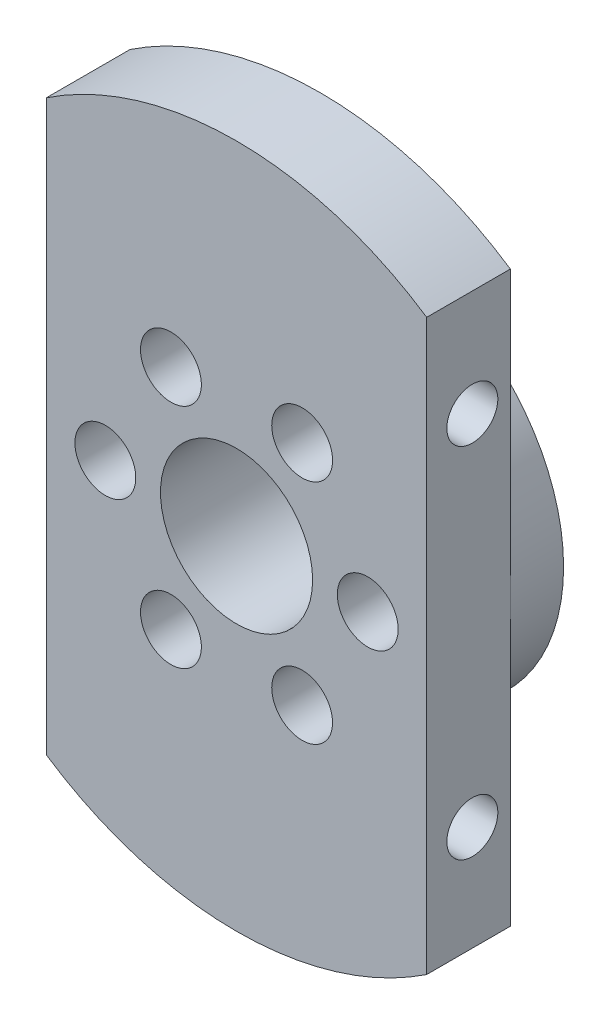
ISO-10303-21;
HEADER;
FILE_DESCRIPTION(('STEP AP214'),'2;1');
FILE_NAME('part.step','',(''),(''),'','','');
FILE_SCHEMA(('AUTOMOTIVE_DESIGN { 1 0 10303 214 1 1 1 1 }'));
ENDSEC;
DATA;
#1=APPLICATION_CONTEXT('core data for automotive mechanical design processes');
#2=APPLICATION_PROTOCOL_DEFINITION('international standard','automotive_design',2000,#1);
#3=PRODUCT_CONTEXT('',#1,'mechanical');
#4=PRODUCT('Part','Part','',(#3));
#5=PRODUCT_RELATED_PRODUCT_CATEGORY('part','',(#4));
#6=PRODUCT_DEFINITION_FORMATION('','',#4);
#7=PRODUCT_DEFINITION_CONTEXT('part definition',#1,'design');
#8=PRODUCT_DEFINITION('design','',#6,#7);
#9=PRODUCT_DEFINITION_SHAPE('','',#8);
#10=(LENGTH_UNIT() NAMED_UNIT(*) SI_UNIT(.MILLI.,.METRE.));
#11=(NAMED_UNIT(*) PLANE_ANGLE_UNIT() SI_UNIT($,.RADIAN.));
#12=(NAMED_UNIT(*) SI_UNIT($,.STERADIAN.) SOLID_ANGLE_UNIT());
#13=UNCERTAINTY_MEASURE_WITH_UNIT(LENGTH_MEASURE(1.E-05),#10,'distance_accuracy_value','');
#14=(GEOMETRIC_REPRESENTATION_CONTEXT(3) GLOBAL_UNCERTAINTY_ASSIGNED_CONTEXT((#13)) GLOBAL_UNIT_ASSIGNED_CONTEXT((#10,
#11,#12)) REPRESENTATION_CONTEXT('',''));
#15=CARTESIAN_POINT('',(0.,0.,0.));
#16=DIRECTION('',(0.,0.,1.));
#17=DIRECTION('',(1.,0.,0.));
#18=AXIS2_PLACEMENT_3D('',#15,#16,#17);
#19=CARTESIAN_POINT('',(25.,0.,0.));
#20=DIRECTION('',(1.,0.,0.));
#21=DIRECTION('',(0.,0.,1.));
#22=AXIS2_PLACEMENT_3D('',#19,#20,#21);
#23=PLANE('',#22);
#24=CARTESIAN_POINT('',(25.,23.45,-6.00000000000001));
#25=DIRECTION('',(-1.,0.,0.));
#26=DIRECTION('',(0.,0.,1.));
#27=AXIS2_PLACEMENT_3D('',#24,#25,#26);
#28=CIRCLE('',#27,3.35);
#29=CARTESIAN_POINT('',(25.,23.45,-2.65000000000001));
#30=VERTEX_POINT('',#29);
#31=EDGE_CURVE('E202',#30,#30,#28,.T.);
#32=ORIENTED_EDGE('',*,*,#31,.T.);
#33=EDGE_LOOP('',(#32));
#34=FACE_BOUND('',#33,.T.);
#35=CARTESIAN_POINT('',(25.,-23.63,-6.));
#36=DIRECTION('',(-1.,0.,0.));
#37=DIRECTION('',(0.,0.,1.));
#38=AXIS2_PLACEMENT_3D('',#35,#36,#37);
#39=CIRCLE('',#38,3.35);
#40=CARTESIAN_POINT('',(25.,-23.63,-2.65));
#41=VERTEX_POINT('',#40);
#42=EDGE_CURVE('E206',#41,#41,#39,.T.);
#43=ORIENTED_EDGE('',*,*,#42,.T.);
#44=EDGE_LOOP('',(#43));
#45=FACE_BOUND('',#44,.T.);
#46=DIRECTION('',(0.,1.,0.));
#47=VECTOR('',#46,1.);
#48=CARTESIAN_POINT('',(25.,0.,-11.));
#49=LINE('',#48,#47);
#50=CARTESIAN_POINT('',(25.,0.,-11.));
#51=VERTEX_POINT('',#50);
#52=CARTESIAN_POINT('',(25.,37.4165738677394,-11.));
#53=VERTEX_POINT('',#52);
#54=EDGE_CURVE('E107',#51,#53,#49,.T.);
#55=ORIENTED_EDGE('',*,*,#54,.T.);
#56=DIRECTION('',(0.,0.,-1.));
#57=VECTOR('',#56,1.);
#58=CARTESIAN_POINT('',(25.,37.4165738677394,0.));
#59=LINE('',#58,#57);
#60=CARTESIAN_POINT('',(25.,37.4165738677394,0.));
#61=VERTEX_POINT('',#60);
#62=EDGE_CURVE('E218',#61,#53,#59,.T.);
#63=ORIENTED_EDGE('',*,*,#62,.F.);
#64=DIRECTION('',(0.,1.,0.));
#65=VECTOR('',#64,1.);
#66=CARTESIAN_POINT('',(25.,0.,0.));
#67=LINE('',#66,#65);
#68=CARTESIAN_POINT('',(25.,-37.4165738677394,0.));
#69=VERTEX_POINT('',#68);
#70=EDGE_CURVE('E201',#69,#61,#67,.T.);
#71=ORIENTED_EDGE('',*,*,#70,.F.);
#72=DIRECTION('',(0.,0.,-1.));
#73=VECTOR('',#72,1.);
#74=CARTESIAN_POINT('',(25.,-37.4165738677394,0.));
#75=LINE('',#74,#73);
#76=CARTESIAN_POINT('',(25.,-37.4165738677394,-11.));
#77=VERTEX_POINT('',#76);
#78=EDGE_CURVE('E226',#69,#77,#75,.T.);
#79=ORIENTED_EDGE('',*,*,#78,.T.);
#80=DIRECTION('',(0.,1.,0.));
#81=VECTOR('',#80,1.);
#82=CARTESIAN_POINT('',(25.,0.,-11.));
#83=LINE('',#82,#81);
#84=EDGE_CURVE('E111',#77,#51,#83,.T.);
#85=ORIENTED_EDGE('',*,*,#84,.T.);
#86=EDGE_LOOP('',(#55,#63,#71,#79,#85));
#87=FACE_BOUND('',#86,.T.);
#88=ADVANCED_FACE('F51',(#34,#45,#87),#23,.T.);
#89=CARTESIAN_POINT('',(-25.,0.,0.));
#90=DIRECTION('',(1.,0.,0.));
#91=DIRECTION('',(0.,0.,1.));
#92=AXIS2_PLACEMENT_3D('',#89,#90,#91);
#93=PLANE('',#92);
#94=CARTESIAN_POINT('',(-25.,23.45,-6.00000000000001));
#95=DIRECTION('',(-1.,0.,0.));
#96=DIRECTION('',(0.,0.,1.));
#97=AXIS2_PLACEMENT_3D('',#94,#95,#96);
#98=CIRCLE('',#97,3.35);
#99=CARTESIAN_POINT('',(-25.,23.45,-2.65000000000001));
#100=VERTEX_POINT('',#99);
#101=EDGE_CURVE('E197',#100,#100,#98,.T.);
#102=ORIENTED_EDGE('',*,*,#101,.F.);
#103=EDGE_LOOP('',(#102));
#104=FACE_BOUND('',#103,.T.);
#105=CARTESIAN_POINT('',(-25.,-23.63,-6.));
#106=DIRECTION('',(-1.,0.,0.));
#107=DIRECTION('',(0.,0.,1.));
#108=AXIS2_PLACEMENT_3D('',#105,#106,#107);
#109=CIRCLE('',#108,3.35);
#110=CARTESIAN_POINT('',(-25.,-23.63,-2.65));
#111=VERTEX_POINT('',#110);
#112=EDGE_CURVE('E210',#111,#111,#109,.T.);
#113=ORIENTED_EDGE('',*,*,#112,.F.);
#114=EDGE_LOOP('',(#113));
#115=FACE_BOUND('',#114,.T.);
#116=DIRECTION('',(0.,-1.,0.));
#117=VECTOR('',#116,1.);
#118=CARTESIAN_POINT('',(-25.,0.,-11.));
#119=LINE('',#118,#117);
#120=CARTESIAN_POINT('',(-25.,0.,-11.));
#121=VERTEX_POINT('',#120);
#122=CARTESIAN_POINT('',(-25.,-37.4165738677394,-11.));
#123=VERTEX_POINT('',#122);
#124=EDGE_CURVE('E121',#121,#123,#119,.T.);
#125=ORIENTED_EDGE('',*,*,#124,.T.);
#126=DIRECTION('',(0.,0.,-1.));
#127=VECTOR('',#126,1.);
#128=CARTESIAN_POINT('',(-25.,-37.4165738677394,0.));
#129=LINE('',#128,#127);
#130=CARTESIAN_POINT('',(-25.,-37.4165738677394,0.));
#131=VERTEX_POINT('',#130);
#132=EDGE_CURVE('E217',#131,#123,#129,.T.);
#133=ORIENTED_EDGE('',*,*,#132,.F.);
#134=DIRECTION('',(0.,1.,0.));
#135=VECTOR('',#134,1.);
#136=CARTESIAN_POINT('',(-25.,0.,0.));
#137=LINE('',#136,#135);
#138=CARTESIAN_POINT('',(-25.,37.4165738677394,0.));
#139=VERTEX_POINT('',#138);
#140=EDGE_CURVE('E214',#131,#139,#137,.T.);
#141=ORIENTED_EDGE('',*,*,#140,.T.);
#142=DIRECTION('',(0.,0.,-1.));
#143=VECTOR('',#142,1.);
#144=CARTESIAN_POINT('',(-25.,37.4165738677394,0.));
#145=LINE('',#144,#143);
#146=CARTESIAN_POINT('',(-25.,37.4165738677394,-11.));
#147=VERTEX_POINT('',#146);
#148=EDGE_CURVE('E129',#139,#147,#145,.T.);
#149=ORIENTED_EDGE('',*,*,#148,.T.);
#150=DIRECTION('',(0.,-1.,0.));
#151=VECTOR('',#150,1.);
#152=CARTESIAN_POINT('',(-25.,0.,-11.));
#153=LINE('',#152,#151);
#154=EDGE_CURVE('E104',#147,#121,#153,.T.);
#155=ORIENTED_EDGE('',*,*,#154,.T.);
#156=EDGE_LOOP('',(#125,#133,#141,#149,#155));
#157=FACE_BOUND('',#156,.T.);
#158=ADVANCED_FACE('F126',(#104,#115,#157),#93,.F.);
#159=CARTESIAN_POINT('',(0.,0.,-15.));
#160=DIRECTION('',(0.,0.,1.));
#161=DIRECTION('',(-1.,0.,0.));
#162=AXIS2_PLACEMENT_3D('',#159,#160,#161);
#163=CYLINDRICAL_SURFACE('',#162,45.);
#164=CARTESIAN_POINT('',(0.,0.,-11.));
#165=DIRECTION('',(0.,0.,1.));
#166=DIRECTION('',(1.,0.,0.));
#167=AXIS2_PLACEMENT_3D('',#164,#165,#166);
#168=CIRCLE('',#167,45.);
#169=EDGE_CURVE('E134',#123,#77,#168,.T.);
#170=ORIENTED_EDGE('',*,*,#169,.T.);
#171=ORIENTED_EDGE('',*,*,#78,.F.);
#172=CARTESIAN_POINT('',(0.,0.,0.));
#173=DIRECTION('',(0.,0.,1.));
#174=DIRECTION('',(1.,0.,0.));
#175=AXIS2_PLACEMENT_3D('',#172,#173,#174);
#176=CIRCLE('',#175,45.);
#177=EDGE_CURVE('E61',#131,#69,#176,.T.);
#178=ORIENTED_EDGE('',*,*,#177,.F.);
#179=ORIENTED_EDGE('',*,*,#132,.T.);
#180=EDGE_LOOP('',(#170,#171,#178,#179));
#181=FACE_BOUND('',#180,.T.);
#182=ADVANCED_FACE('F53',(#181),#163,.T.);
#183=CARTESIAN_POINT('',(0.,0.,-11.));
#184=DIRECTION('',(0.,0.,1.));
#185=DIRECTION('',(1.,0.,0.));
#186=AXIS2_PLACEMENT_3D('',#183,#184,#185);
#187=CIRCLE('',#186,45.);
#188=EDGE_CURVE('E69',#53,#147,#187,.T.);
#189=ORIENTED_EDGE('',*,*,#188,.T.);
#190=ORIENTED_EDGE('',*,*,#148,.F.);
#191=EDGE_CURVE('E11',#61,#139,#176,.T.);
#192=ORIENTED_EDGE('',*,*,#191,.F.);
#193=ORIENTED_EDGE('',*,*,#62,.T.);
#194=EDGE_LOOP('',(#189,#190,#192,#193));
#195=FACE_BOUND('',#194,.T.);
#196=ADVANCED_FACE('F303',(#195),#163,.T.);
#197=CARTESIAN_POINT('',(8.62499999999997,-14.9389382152816,0.));
#198=DIRECTION('',(0.,0.,-1.));
#199=DIRECTION('',(1.,0.,0.));
#200=AXIS2_PLACEMENT_3D('',#197,#198,#199);
#201=CYLINDRICAL_SURFACE('',#200,2.2);
#202=CARTESIAN_POINT('',(8.62499999999997,-14.9389382152816,-9.));
#203=DIRECTION('',(0.,0.,-1.));
#204=DIRECTION('',(-1.,0.,0.));
#205=AXIS2_PLACEMENT_3D('',#202,#203,#204);
#206=CIRCLE('',#205,2.2);
#207=CARTESIAN_POINT('',(6.42499999999997,-14.9389382152816,-9.));
#208=VERTEX_POINT('',#207);
#209=EDGE_CURVE('E55',#208,#208,#206,.F.);
#210=ORIENTED_EDGE('',*,*,#209,.T.);
#211=EDGE_LOOP('',(#210));
#212=FACE_BOUND('',#211,.T.);
#213=CARTESIAN_POINT('',(8.62499999999997,-14.9389382152816,-18.));
#214=DIRECTION('',(0.,0.,1.));
#215=DIRECTION('',(1.,0.,0.));
#216=AXIS2_PLACEMENT_3D('',#213,#214,#215);
#217=CIRCLE('',#216,2.2);
#218=CARTESIAN_POINT('',(10.825,-14.9389382152816,-18.));
#219=VERTEX_POINT('',#218);
#220=EDGE_CURVE('E341',#219,#219,#217,.T.);
#221=ORIENTED_EDGE('',*,*,#220,.F.);
#222=EDGE_LOOP('',(#221));
#223=FACE_BOUND('',#222,.T.);
#224=ADVANCED_FACE('F260',(#212,#223),#201,.F.);
#225=CARTESIAN_POINT('',(-8.62500000000007,-14.9389382152815,0.));
#226=DIRECTION('',(0.,0.,-1.));
#227=DIRECTION('',(1.,0.,0.));
#228=AXIS2_PLACEMENT_3D('',#225,#226,#227);
#229=CYLINDRICAL_SURFACE('',#228,2.2);
#230=CARTESIAN_POINT('',(-8.62500000000007,-14.9389382152815,-9.));
#231=DIRECTION('',(0.,0.,-1.));
#232=DIRECTION('',(-1.,0.,0.));
#233=AXIS2_PLACEMENT_3D('',#230,#231,#232);
#234=CIRCLE('',#233,2.2);
#235=CARTESIAN_POINT('',(-10.8250000000001,-14.9389382152815,-9.));
#236=VERTEX_POINT('',#235);
#237=EDGE_CURVE('E249',#236,#236,#234,.F.);
#238=ORIENTED_EDGE('',*,*,#237,.T.);
#239=EDGE_LOOP('',(#238));
#240=FACE_BOUND('',#239,.T.);
#241=CARTESIAN_POINT('',(-8.62500000000007,-14.9389382152815,-18.));
#242=DIRECTION('',(0.,0.,1.));
#243=DIRECTION('',(1.,0.,0.));
#244=AXIS2_PLACEMENT_3D('',#241,#242,#243);
#245=CIRCLE('',#244,2.2);
#246=CARTESIAN_POINT('',(-6.42500000000007,-14.9389382152815,-18.));
#247=VERTEX_POINT('',#246);
#248=EDGE_CURVE('E350',#247,#247,#245,.T.);
#249=ORIENTED_EDGE('',*,*,#248,.F.);
#250=EDGE_LOOP('',(#249));
#251=FACE_BOUND('',#250,.T.);
#252=ADVANCED_FACE('F302',(#240,#251),#229,.F.);
#253=CARTESIAN_POINT('',(-17.25,1.20456106190088E-13,0.));
#254=DIRECTION('',(0.,0.,-1.));
#255=DIRECTION('',(1.,0.,0.));
#256=AXIS2_PLACEMENT_3D('',#253,#254,#255);
#257=CYLINDRICAL_SURFACE('',#256,2.2);
#258=CARTESIAN_POINT('',(-17.25,1.20456106190088E-13,-9.));
#259=DIRECTION('',(0.,0.,-1.));
#260=DIRECTION('',(-1.,0.,0.));
#261=AXIS2_PLACEMENT_3D('',#258,#259,#260);
#262=CIRCLE('',#261,2.2);
#263=CARTESIAN_POINT('',(-19.45,1.20456106190088E-13,-9.));
#264=VERTEX_POINT('',#263);
#265=EDGE_CURVE('E246',#264,#264,#262,.F.);
#266=ORIENTED_EDGE('',*,*,#265,.T.);
#267=EDGE_LOOP('',(#266));
#268=FACE_BOUND('',#267,.T.);
#269=CARTESIAN_POINT('',(-17.25,1.20456106190088E-13,-18.));
#270=DIRECTION('',(0.,0.,1.));
#271=DIRECTION('',(1.,0.,0.));
#272=AXIS2_PLACEMENT_3D('',#269,#270,#271);
#273=CIRCLE('',#272,2.2);
#274=CARTESIAN_POINT('',(-15.05,1.20456106190088E-13,-18.));
#275=VERTEX_POINT('',#274);
#276=EDGE_CURVE('E376',#275,#275,#273,.T.);
#277=ORIENTED_EDGE('',*,*,#276,.F.);
#278=EDGE_LOOP('',(#277));
#279=FACE_BOUND('',#278,.T.);
#280=ADVANCED_FACE('F306',(#268,#279),#257,.F.);
#281=CARTESIAN_POINT('',(-8.62499999999986,14.9389382152816,0.));
#282=DIRECTION('',(0.,0.,-1.));
#283=DIRECTION('',(1.,0.,0.));
#284=AXIS2_PLACEMENT_3D('',#281,#282,#283);
#285=CYLINDRICAL_SURFACE('',#284,2.2);
#286=CARTESIAN_POINT('',(-8.62499999999986,14.9389382152816,-9.));
#287=DIRECTION('',(0.,0.,-1.));
#288=DIRECTION('',(-1.,0.,0.));
#289=AXIS2_PLACEMENT_3D('',#286,#287,#288);
#290=CIRCLE('',#289,2.2);
#291=CARTESIAN_POINT('',(-10.8249999999999,14.9389382152816,-9.));
#292=VERTEX_POINT('',#291);
#293=EDGE_CURVE('E242',#292,#292,#290,.F.);
#294=ORIENTED_EDGE('',*,*,#293,.T.);
#295=EDGE_LOOP('',(#294));
#296=FACE_BOUND('',#295,.T.);
#297=CARTESIAN_POINT('',(-8.62499999999986,14.9389382152816,-18.));
#298=DIRECTION('',(0.,0.,1.));
#299=DIRECTION('',(1.,0.,0.));
#300=AXIS2_PLACEMENT_3D('',#297,#298,#299);
#301=CIRCLE('',#300,2.2);
#302=CARTESIAN_POINT('',(-6.42499999999986,14.9389382152816,-18.));
#303=VERTEX_POINT('',#302);
#304=EDGE_CURVE('E373',#303,#303,#301,.T.);
#305=ORIENTED_EDGE('',*,*,#304,.F.);
#306=EDGE_LOOP('',(#305));
#307=FACE_BOUND('',#306,.T.);
#308=ADVANCED_FACE('F298',(#296,#307),#285,.F.);
#309=CARTESIAN_POINT('',(8.62500000000017,14.9389382152815,0.));
#310=DIRECTION('',(0.,0.,-1.));
#311=DIRECTION('',(1.,0.,0.));
#312=AXIS2_PLACEMENT_3D('',#309,#310,#311);
#313=CYLINDRICAL_SURFACE('',#312,2.2);
#314=CARTESIAN_POINT('',(8.62500000000017,14.9389382152815,-9.));
#315=DIRECTION('',(0.,0.,-1.));
#316=DIRECTION('',(-1.,0.,0.));
#317=AXIS2_PLACEMENT_3D('',#314,#315,#316);
#318=CIRCLE('',#317,2.2);
#319=CARTESIAN_POINT('',(6.42500000000017,14.9389382152815,-9.));
#320=VERTEX_POINT('',#319);
#321=EDGE_CURVE('E238',#320,#320,#318,.F.);
#322=ORIENTED_EDGE('',*,*,#321,.T.);
#323=EDGE_LOOP('',(#322));
#324=FACE_BOUND('',#323,.T.);
#325=CARTESIAN_POINT('',(8.62500000000017,14.9389382152815,-18.));
#326=DIRECTION('',(0.,0.,1.));
#327=DIRECTION('',(1.,0.,0.));
#328=AXIS2_PLACEMENT_3D('',#325,#326,#327);
#329=CIRCLE('',#328,2.2);
#330=CARTESIAN_POINT('',(10.8250000000002,14.9389382152815,-18.));
#331=VERTEX_POINT('',#330);
#332=EDGE_CURVE('E347',#331,#331,#329,.T.);
#333=ORIENTED_EDGE('',*,*,#332,.F.);
#334=EDGE_LOOP('',(#333));
#335=FACE_BOUND('',#334,.T.);
#336=ADVANCED_FACE('F294',(#324,#335),#313,.F.);
#337=CARTESIAN_POINT('',(17.25,0.,0.));
#338=DIRECTION('',(0.,0.,-1.));
#339=DIRECTION('',(1.,0.,0.));
#340=AXIS2_PLACEMENT_3D('',#337,#338,#339);
#341=CYLINDRICAL_SURFACE('',#340,2.2);
#342=CARTESIAN_POINT('',(17.25,0.,-9.));
#343=DIRECTION('',(0.,0.,-1.));
#344=DIRECTION('',(-1.,0.,0.));
#345=AXIS2_PLACEMENT_3D('',#342,#343,#344);
#346=CIRCLE('',#345,2.2);
#347=CARTESIAN_POINT('',(15.05,0.,-9.));
#348=VERTEX_POINT('',#347);
#349=EDGE_CURVE('E153',#348,#348,#346,.F.);
#350=ORIENTED_EDGE('',*,*,#349,.T.);
#351=EDGE_LOOP('',(#350));
#352=FACE_BOUND('',#351,.T.);
#353=CARTESIAN_POINT('',(17.25,0.,-18.));
#354=DIRECTION('',(0.,0.,1.));
#355=DIRECTION('',(1.,0.,0.));
#356=AXIS2_PLACEMENT_3D('',#353,#354,#355);
#357=CIRCLE('',#356,2.2);
#358=CARTESIAN_POINT('',(19.45,0.,-18.));
#359=VERTEX_POINT('',#358);
#360=EDGE_CURVE('E340',#359,#359,#357,.T.);
#361=ORIENTED_EDGE('',*,*,#360,.F.);
#362=EDGE_LOOP('',(#361));
#363=FACE_BOUND('',#362,.T.);
#364=ADVANCED_FACE('F290',(#352,#363),#341,.F.);
#365=CARTESIAN_POINT('',(0.,0.,0.));
#366=DIRECTION('',(0.,0.,-1.));
#367=DIRECTION('',(1.,0.,0.));
#368=AXIS2_PLACEMENT_3D('',#365,#366,#367);
#369=PLANE('',#368);
#370=CARTESIAN_POINT('',(17.25,0.,0.));
#371=DIRECTION('',(0.,0.,-1.));
#372=DIRECTION('',(-1.,0.,0.));
#373=AXIS2_PLACEMENT_3D('',#370,#371,#372);
#374=CIRCLE('',#373,4.);
#375=CARTESIAN_POINT('',(13.25,0.,0.));
#376=VERTEX_POINT('',#375);
#377=EDGE_CURVE('E154',#376,#376,#374,.T.);
#378=ORIENTED_EDGE('',*,*,#377,.T.);
#379=EDGE_LOOP('',(#378));
#380=FACE_BOUND('',#379,.T.);
#381=CARTESIAN_POINT('',(-8.62499999999986,14.9389382152816,0.));
#382=DIRECTION('',(0.,0.,-1.));
#383=DIRECTION('',(-1.,0.,0.));
#384=AXIS2_PLACEMENT_3D('',#381,#382,#383);
#385=CIRCLE('',#384,4.);
#386=CARTESIAN_POINT('',(-12.6249999999999,14.9389382152816,0.));
#387=VERTEX_POINT('',#386);
#388=EDGE_CURVE('E159',#387,#387,#385,.T.);
#389=ORIENTED_EDGE('',*,*,#388,.T.);
#390=EDGE_LOOP('',(#389));
#391=FACE_BOUND('',#390,.T.);
#392=CARTESIAN_POINT('',(-17.25,1.20456106190088E-13,0.));
#393=DIRECTION('',(0.,0.,-1.));
#394=DIRECTION('',(-1.,0.,0.));
#395=AXIS2_PLACEMENT_3D('',#392,#393,#394);
#396=CIRCLE('',#395,4.);
#397=CARTESIAN_POINT('',(-21.25,1.20456106190088E-13,0.));
#398=VERTEX_POINT('',#397);
#399=EDGE_CURVE('E190',#398,#398,#396,.T.);
#400=ORIENTED_EDGE('',*,*,#399,.T.);
#401=EDGE_LOOP('',(#400));
#402=FACE_BOUND('',#401,.T.);
#403=CARTESIAN_POINT('',(-8.62500000000007,-14.9389382152815,0.));
#404=DIRECTION('',(0.,0.,-1.));
#405=DIRECTION('',(-1.,0.,0.));
#406=AXIS2_PLACEMENT_3D('',#403,#404,#405);
#407=CIRCLE('',#406,4.);
#408=CARTESIAN_POINT('',(-12.6250000000001,-14.9389382152815,0.));
#409=VERTEX_POINT('',#408);
#410=EDGE_CURVE('E182',#409,#409,#407,.T.);
#411=ORIENTED_EDGE('',*,*,#410,.T.);
#412=EDGE_LOOP('',(#411));
#413=FACE_BOUND('',#412,.T.);
#414=CARTESIAN_POINT('',(8.62499999999997,-14.9389382152816,0.));
#415=DIRECTION('',(0.,0.,-1.));
#416=DIRECTION('',(-1.,0.,0.));
#417=AXIS2_PLACEMENT_3D('',#414,#415,#416);
#418=CIRCLE('',#417,4.);
#419=CARTESIAN_POINT('',(4.62499999999997,-14.9389382152816,0.));
#420=VERTEX_POINT('',#419);
#421=EDGE_CURVE('E174',#420,#420,#418,.T.);
#422=ORIENTED_EDGE('',*,*,#421,.T.);
#423=EDGE_LOOP('',(#422));
#424=FACE_BOUND('',#423,.T.);
#425=CARTESIAN_POINT('',(8.62500000000017,14.9389382152815,0.));
#426=DIRECTION('',(0.,0.,-1.));
#427=DIRECTION('',(-1.,0.,0.));
#428=AXIS2_PLACEMENT_3D('',#425,#426,#427);
#429=CIRCLE('',#428,4.);
#430=CARTESIAN_POINT('',(4.62500000000017,14.9389382152815,0.));
#431=VERTEX_POINT('',#430);
#432=EDGE_CURVE('E158',#431,#431,#429,.T.);
#433=ORIENTED_EDGE('',*,*,#432,.T.);
#434=EDGE_LOOP('',(#433));
#435=FACE_BOUND('',#434,.T.);
#436=CARTESIAN_POINT('',(0.,0.,0.));
#437=DIRECTION('',(0.,0.,1.));
#438=DIRECTION('',(1.,0.,0.));
#439=AXIS2_PLACEMENT_3D('',#436,#437,#438);
#440=CIRCLE('',#439,10.);
#441=CARTESIAN_POINT('',(10.,0.,0.));
#442=VERTEX_POINT('',#441);
#443=EDGE_CURVE('E221',#442,#442,#440,.T.);
#444=ORIENTED_EDGE('',*,*,#443,.F.);
#445=EDGE_LOOP('',(#444));
#446=FACE_BOUND('',#445,.T.);
#447=ORIENTED_EDGE('',*,*,#177,.T.);
#448=ORIENTED_EDGE('',*,*,#70,.T.);
#449=ORIENTED_EDGE('',*,*,#191,.T.);
#450=ORIENTED_EDGE('',*,*,#140,.F.);
#451=EDGE_LOOP('',(#447,#448,#449,#450));
#452=FACE_BOUND('',#451,.T.);
#453=ADVANCED_FACE('F293',(#380,#391,#402,#413,#424,#435,#446,#452),#369,.F.);
#454=CARTESIAN_POINT('',(0.,0.,11.));
#455=DIRECTION('',(0.,0.,-1.));
#456=DIRECTION('',(1.,0.,0.));
#457=AXIS2_PLACEMENT_3D('',#454,#455,#456);
#458=CYLINDRICAL_SURFACE('',#457,10.);
#459=ORIENTED_EDGE('',*,*,#443,.T.);
#460=EDGE_LOOP('',(#459));
#461=FACE_BOUND('',#460,.T.);
#462=CARTESIAN_POINT('',(0.,0.,-18.));
#463=DIRECTION('',(0.,0.,1.));
#464=DIRECTION('',(1.,0.,0.));
#465=AXIS2_PLACEMENT_3D('',#462,#463,#464);
#466=CIRCLE('',#465,10.);
#467=CARTESIAN_POINT('',(10.,0.,-18.));
#468=VERTEX_POINT('',#467);
#469=EDGE_CURVE('E337',#468,#468,#466,.T.);
#470=ORIENTED_EDGE('',*,*,#469,.F.);
#471=EDGE_LOOP('',(#470));
#472=FACE_BOUND('',#471,.T.);
#473=ADVANCED_FACE('F313',(#461,#472),#458,.F.);
#474=CARTESIAN_POINT('',(-25.,-23.63,-6.));
#475=DIRECTION('',(1.,0.,0.));
#476=DIRECTION('',(0.,0.,1.));
#477=AXIS2_PLACEMENT_3D('',#474,#475,#476);
#478=CYLINDRICAL_SURFACE('',#477,3.35);
#479=ORIENTED_EDGE('',*,*,#112,.T.);
#480=EDGE_LOOP('',(#479));
#481=FACE_BOUND('',#480,.T.);
#482=ORIENTED_EDGE('',*,*,#42,.F.);
#483=EDGE_LOOP('',(#482));
#484=FACE_BOUND('',#483,.T.);
#485=ADVANCED_FACE('F315',(#481,#484),#478,.F.);
#486=CARTESIAN_POINT('',(-25.,23.45,-6.00000000000001));
#487=DIRECTION('',(1.,0.,0.));
#488=DIRECTION('',(0.,0.,1.));
#489=AXIS2_PLACEMENT_3D('',#486,#487,#488);
#490=CYLINDRICAL_SURFACE('',#489,3.35);
#491=ORIENTED_EDGE('',*,*,#101,.T.);
#492=EDGE_LOOP('',(#491));
#493=FACE_BOUND('',#492,.T.);
#494=ORIENTED_EDGE('',*,*,#31,.F.);
#495=EDGE_LOOP('',(#494));
#496=FACE_BOUND('',#495,.T.);
#497=ADVANCED_FACE('F447',(#493,#496),#490,.F.);
#498=CARTESIAN_POINT('',(17.25,0.,-9.));
#499=DIRECTION('',(0.,0.,1.));
#500=DIRECTION('',(-1.,0.,0.));
#501=AXIS2_PLACEMENT_3D('',#498,#499,#500);
#502=PLANE('',#501);
#503=CARTESIAN_POINT('',(17.25,0.,-9.));
#504=DIRECTION('',(0.,0.,-1.));
#505=DIRECTION('',(-1.,0.,0.));
#506=AXIS2_PLACEMENT_3D('',#503,#504,#505);
#507=CIRCLE('',#506,4.);
#508=CARTESIAN_POINT('',(13.25,0.,-9.));
#509=VERTEX_POINT('',#508);
#510=EDGE_CURVE('E149',#509,#509,#507,.T.);
#511=ORIENTED_EDGE('',*,*,#510,.F.);
#512=EDGE_LOOP('',(#511));
#513=FACE_BOUND('',#512,.T.);
#514=ORIENTED_EDGE('',*,*,#349,.F.);
#515=EDGE_LOOP('',(#514));
#516=FACE_BOUND('',#515,.T.);
#517=ADVANCED_FACE('F443',(#513,#516),#502,.T.);
#518=CARTESIAN_POINT('',(17.25,0.,-9.));
#519=DIRECTION('',(0.,0.,1.));
#520=DIRECTION('',(-1.,0.,0.));
#521=AXIS2_PLACEMENT_3D('',#518,#519,#520);
#522=CYLINDRICAL_SURFACE('',#521,4.);
#523=ORIENTED_EDGE('',*,*,#510,.T.);
#524=EDGE_LOOP('',(#523));
#525=FACE_BOUND('',#524,.T.);
#526=ORIENTED_EDGE('',*,*,#377,.F.);
#527=EDGE_LOOP('',(#526));
#528=FACE_BOUND('',#527,.T.);
#529=ADVANCED_FACE('F446',(#525,#528),#522,.F.);
#530=CARTESIAN_POINT('',(8.62500000000017,14.9389382152815,-9.));
#531=DIRECTION('',(0.,0.,1.));
#532=DIRECTION('',(-1.,0.,0.));
#533=AXIS2_PLACEMENT_3D('',#530,#531,#532);
#534=PLANE('',#533);
#535=CARTESIAN_POINT('',(8.62500000000017,14.9389382152815,-9.));
#536=DIRECTION('',(0.,0.,-1.));
#537=DIRECTION('',(-1.,0.,0.));
#538=AXIS2_PLACEMENT_3D('',#535,#536,#537);
#539=CIRCLE('',#538,4.);
#540=CARTESIAN_POINT('',(4.62500000000017,14.9389382152815,-9.));
#541=VERTEX_POINT('',#540);
#542=EDGE_CURVE('E170',#541,#541,#539,.T.);
#543=ORIENTED_EDGE('',*,*,#542,.F.);
#544=EDGE_LOOP('',(#543));
#545=FACE_BOUND('',#544,.T.);
#546=ORIENTED_EDGE('',*,*,#321,.F.);
#547=EDGE_LOOP('',(#546));
#548=FACE_BOUND('',#547,.T.);
#549=ADVANCED_FACE('F451',(#545,#548),#534,.T.);
#550=CARTESIAN_POINT('',(8.62500000000017,14.9389382152815,-9.));
#551=DIRECTION('',(0.,0.,1.));
#552=DIRECTION('',(-1.,0.,0.));
#553=AXIS2_PLACEMENT_3D('',#550,#551,#552);
#554=CYLINDRICAL_SURFACE('',#553,4.);
#555=ORIENTED_EDGE('',*,*,#542,.T.);
#556=EDGE_LOOP('',(#555));
#557=FACE_BOUND('',#556,.T.);
#558=ORIENTED_EDGE('',*,*,#432,.F.);
#559=EDGE_LOOP('',(#558));
#560=FACE_BOUND('',#559,.T.);
#561=ADVANCED_FACE('F461',(#557,#560),#554,.F.);
#562=CARTESIAN_POINT('',(-8.62499999999986,14.9389382152816,-9.));
#563=DIRECTION('',(0.,0.,1.));
#564=DIRECTION('',(-1.,0.,0.));
#565=AXIS2_PLACEMENT_3D('',#562,#563,#564);
#566=PLANE('',#565);
#567=CARTESIAN_POINT('',(-8.62499999999986,14.9389382152816,-9.));
#568=DIRECTION('',(0.,0.,-1.));
#569=DIRECTION('',(-1.,0.,0.));
#570=AXIS2_PLACEMENT_3D('',#567,#568,#569);
#571=CIRCLE('',#570,4.);
#572=CARTESIAN_POINT('',(-12.6249999999999,14.9389382152816,-9.));
#573=VERTEX_POINT('',#572);
#574=EDGE_CURVE('E131',#573,#573,#571,.T.);
#575=ORIENTED_EDGE('',*,*,#574,.F.);
#576=EDGE_LOOP('',(#575));
#577=FACE_BOUND('',#576,.T.);
#578=ORIENTED_EDGE('',*,*,#293,.F.);
#579=EDGE_LOOP('',(#578));
#580=FACE_BOUND('',#579,.T.);
#581=ADVANCED_FACE('F457',(#577,#580),#566,.T.);
#582=CARTESIAN_POINT('',(-8.62499999999986,14.9389382152816,-9.));
#583=DIRECTION('',(0.,0.,1.));
#584=DIRECTION('',(-1.,0.,0.));
#585=AXIS2_PLACEMENT_3D('',#582,#583,#584);
#586=CYLINDRICAL_SURFACE('',#585,4.);
#587=ORIENTED_EDGE('',*,*,#574,.T.);
#588=EDGE_LOOP('',(#587));
#589=FACE_BOUND('',#588,.T.);
#590=ORIENTED_EDGE('',*,*,#388,.F.);
#591=EDGE_LOOP('',(#590));
#592=FACE_BOUND('',#591,.T.);
#593=ADVANCED_FACE('F453',(#589,#592),#586,.F.);
#594=CARTESIAN_POINT('',(-17.25,1.20456106190088E-13,-9.));
#595=DIRECTION('',(0.,0.,1.));
#596=DIRECTION('',(-1.,0.,0.));
#597=AXIS2_PLACEMENT_3D('',#594,#595,#596);
#598=PLANE('',#597);
#599=CARTESIAN_POINT('',(-17.25,1.20456106190088E-13,-9.));
#600=DIRECTION('',(0.,0.,-1.));
#601=DIRECTION('',(-1.,0.,0.));
#602=AXIS2_PLACEMENT_3D('',#599,#600,#601);
#603=CIRCLE('',#602,4.);
#604=CARTESIAN_POINT('',(-21.25,1.20456106190088E-13,-9.));
#605=VERTEX_POINT('',#604);
#606=EDGE_CURVE('E163',#605,#605,#603,.T.);
#607=ORIENTED_EDGE('',*,*,#606,.F.);
#608=EDGE_LOOP('',(#607));
#609=FACE_BOUND('',#608,.T.);
#610=ORIENTED_EDGE('',*,*,#265,.F.);
#611=EDGE_LOOP('',(#610));
#612=FACE_BOUND('',#611,.T.);
#613=ADVANCED_FACE('F456',(#609,#612),#598,.T.);
#614=CARTESIAN_POINT('',(-17.25,1.20456106190088E-13,-9.));
#615=DIRECTION('',(0.,0.,1.));
#616=DIRECTION('',(-1.,0.,0.));
#617=AXIS2_PLACEMENT_3D('',#614,#615,#616);
#618=CYLINDRICAL_SURFACE('',#617,4.);
#619=ORIENTED_EDGE('',*,*,#606,.T.);
#620=EDGE_LOOP('',(#619));
#621=FACE_BOUND('',#620,.T.);
#622=ORIENTED_EDGE('',*,*,#399,.F.);
#623=EDGE_LOOP('',(#622));
#624=FACE_BOUND('',#623,.T.);
#625=ADVANCED_FACE('F498',(#621,#624),#618,.F.);
#626=CARTESIAN_POINT('',(-8.62500000000007,-14.9389382152815,-9.));
#627=DIRECTION('',(0.,0.,1.));
#628=DIRECTION('',(-1.,0.,0.));
#629=AXIS2_PLACEMENT_3D('',#626,#627,#628);
#630=PLANE('',#629);
#631=CARTESIAN_POINT('',(-8.62500000000007,-14.9389382152815,-9.));
#632=DIRECTION('',(0.,0.,-1.));
#633=DIRECTION('',(-1.,0.,0.));
#634=AXIS2_PLACEMENT_3D('',#631,#632,#633);
#635=CIRCLE('',#634,4.);
#636=CARTESIAN_POINT('',(-12.6250000000001,-14.9389382152815,-9.));
#637=VERTEX_POINT('',#636);
#638=EDGE_CURVE('E186',#637,#637,#635,.T.);
#639=ORIENTED_EDGE('',*,*,#638,.F.);
#640=EDGE_LOOP('',(#639));
#641=FACE_BOUND('',#640,.T.);
#642=ORIENTED_EDGE('',*,*,#237,.F.);
#643=EDGE_LOOP('',(#642));
#644=FACE_BOUND('',#643,.T.);
#645=ADVANCED_FACE('F275',(#641,#644),#630,.T.);
#646=CARTESIAN_POINT('',(-8.62500000000007,-14.9389382152815,-9.));
#647=DIRECTION('',(0.,0.,1.));
#648=DIRECTION('',(-1.,0.,0.));
#649=AXIS2_PLACEMENT_3D('',#646,#647,#648);
#650=CYLINDRICAL_SURFACE('',#649,4.);
#651=ORIENTED_EDGE('',*,*,#638,.T.);
#652=EDGE_LOOP('',(#651));
#653=FACE_BOUND('',#652,.T.);
#654=ORIENTED_EDGE('',*,*,#410,.F.);
#655=EDGE_LOOP('',(#654));
#656=FACE_BOUND('',#655,.T.);
#657=ADVANCED_FACE('F266',(#653,#656),#650,.F.);
#658=CARTESIAN_POINT('',(8.62499999999997,-14.9389382152816,-9.));
#659=DIRECTION('',(0.,0.,1.));
#660=DIRECTION('',(-1.,0.,0.));
#661=AXIS2_PLACEMENT_3D('',#658,#659,#660);
#662=PLANE('',#661);
#663=CARTESIAN_POINT('',(8.62499999999997,-14.9389382152816,-9.));
#664=DIRECTION('',(0.,0.,-1.));
#665=DIRECTION('',(-1.,0.,0.));
#666=AXIS2_PLACEMENT_3D('',#663,#664,#665);
#667=CIRCLE('',#666,4.);
#668=CARTESIAN_POINT('',(4.62499999999997,-14.9389382152816,-9.));
#669=VERTEX_POINT('',#668);
#670=EDGE_CURVE('E178',#669,#669,#667,.T.);
#671=ORIENTED_EDGE('',*,*,#670,.F.);
#672=EDGE_LOOP('',(#671));
#673=FACE_BOUND('',#672,.T.);
#674=ORIENTED_EDGE('',*,*,#209,.F.);
#675=EDGE_LOOP('',(#674));
#676=FACE_BOUND('',#675,.T.);
#677=ADVANCED_FACE('F263',(#673,#676),#662,.T.);
#678=CARTESIAN_POINT('',(8.62499999999997,-14.9389382152816,-9.));
#679=DIRECTION('',(0.,0.,1.));
#680=DIRECTION('',(-1.,0.,0.));
#681=AXIS2_PLACEMENT_3D('',#678,#679,#680);
#682=CYLINDRICAL_SURFACE('',#681,4.);
#683=ORIENTED_EDGE('',*,*,#670,.T.);
#684=EDGE_LOOP('',(#683));
#685=FACE_BOUND('',#684,.T.);
#686=ORIENTED_EDGE('',*,*,#421,.F.);
#687=EDGE_LOOP('',(#686));
#688=FACE_BOUND('',#687,.T.);
#689=ADVANCED_FACE('F265',(#685,#688),#682,.F.);
#690=CARTESIAN_POINT('',(0.,0.,-11.));
#691=DIRECTION('',(0.,0.,-1.));
#692=DIRECTION('',(1.,0.,0.));
#693=AXIS2_PLACEMENT_3D('',#690,#691,#692);
#694=CYLINDRICAL_SURFACE('',#693,25.);
#695=CARTESIAN_POINT('',(0.,0.,-11.));
#696=DIRECTION('',(0.,0.,1.));
#697=DIRECTION('',(1.,0.,0.));
#698=AXIS2_PLACEMENT_3D('',#695,#696,#697);
#699=CIRCLE('',#698,25.);
#700=EDGE_CURVE('E113',#121,#51,#699,.T.);
#701=ORIENTED_EDGE('',*,*,#700,.F.);
#702=CARTESIAN_POINT('',(0.,0.,-11.));
#703=DIRECTION('',(0.,0.,1.));
#704=DIRECTION('',(1.,0.,0.));
#705=AXIS2_PLACEMENT_3D('',#702,#703,#704);
#706=CIRCLE('',#705,25.);
#707=EDGE_CURVE('E100',#51,#121,#706,.T.);
#708=ORIENTED_EDGE('',*,*,#707,.F.);
#709=EDGE_LOOP('',(#701,#708));
#710=FACE_BOUND('',#709,.T.);
#711=CARTESIAN_POINT('',(0.,0.,-18.));
#712=DIRECTION('',(0.,0.,1.));
#713=DIRECTION('',(1.,0.,0.));
#714=AXIS2_PLACEMENT_3D('',#711,#712,#713);
#715=CIRCLE('',#714,25.);
#716=CARTESIAN_POINT('',(25.,0.,-18.));
#717=VERTEX_POINT('',#716);
#718=EDGE_CURVE('E122',#717,#717,#715,.T.);
#719=ORIENTED_EDGE('',*,*,#718,.T.);
#720=EDGE_LOOP('',(#719));
#721=FACE_BOUND('',#720,.T.);
#722=ADVANCED_FACE('F114',(#710,#721),#694,.T.);
#723=CARTESIAN_POINT('',(0.,0.,-11.));
#724=DIRECTION('',(0.,0.,-1.));
#725=DIRECTION('',(1.,0.,0.));
#726=AXIS2_PLACEMENT_3D('',#723,#724,#725);
#727=PLANE('',#726);
#728=ORIENTED_EDGE('',*,*,#707,.T.);
#729=ORIENTED_EDGE('',*,*,#154,.F.);
#730=ORIENTED_EDGE('',*,*,#188,.F.);
#731=ORIENTED_EDGE('',*,*,#54,.F.);
#732=EDGE_LOOP('',(#728,#729,#730,#731));
#733=FACE_BOUND('',#732,.T.);
#734=ADVANCED_FACE('F102',(#733),#727,.T.);
#735=CARTESIAN_POINT('',(0.,0.,-11.));
#736=DIRECTION('',(0.,0.,-1.));
#737=DIRECTION('',(1.,0.,0.));
#738=AXIS2_PLACEMENT_3D('',#735,#736,#737);
#739=PLANE('',#738);
#740=ORIENTED_EDGE('',*,*,#700,.T.);
#741=ORIENTED_EDGE('',*,*,#84,.F.);
#742=ORIENTED_EDGE('',*,*,#169,.F.);
#743=ORIENTED_EDGE('',*,*,#124,.F.);
#744=EDGE_LOOP('',(#740,#741,#742,#743));
#745=FACE_BOUND('',#744,.T.);
#746=ADVANCED_FACE('F133',(#745),#739,.T.);
#747=CARTESIAN_POINT('',(0.,0.,-18.));
#748=DIRECTION('',(0.,0.,-1.));
#749=DIRECTION('',(1.,0.,0.));
#750=AXIS2_PLACEMENT_3D('',#747,#748,#749);
#751=PLANE('',#750);
#752=ORIENTED_EDGE('',*,*,#276,.T.);
#753=EDGE_LOOP('',(#752));
#754=FACE_BOUND('',#753,.T.);
#755=ORIENTED_EDGE('',*,*,#220,.T.);
#756=EDGE_LOOP('',(#755));
#757=FACE_BOUND('',#756,.T.);
#758=ORIENTED_EDGE('',*,*,#360,.T.);
#759=EDGE_LOOP('',(#758));
#760=FACE_BOUND('',#759,.T.);
#761=ORIENTED_EDGE('',*,*,#718,.F.);
#762=EDGE_LOOP('',(#761));
#763=FACE_BOUND('',#762,.T.);
#764=ORIENTED_EDGE('',*,*,#332,.T.);
#765=EDGE_LOOP('',(#764));
#766=FACE_BOUND('',#765,.T.);
#767=ORIENTED_EDGE('',*,*,#469,.T.);
#768=EDGE_LOOP('',(#767));
#769=FACE_BOUND('',#768,.T.);
#770=ORIENTED_EDGE('',*,*,#248,.T.);
#771=EDGE_LOOP('',(#770));
#772=FACE_BOUND('',#771,.T.);
#773=ORIENTED_EDGE('',*,*,#304,.T.);
#774=EDGE_LOOP('',(#773));
#775=FACE_BOUND('',#774,.T.);
#776=ADVANCED_FACE('F361',(#754,#757,#760,#763,#766,#769,#772,#775),#751,.T.);
#777=CLOSED_SHELL('',(#88,#158,#182,#196,#224,#252,#280,#308,#336,#364,#453,#473,#485,#497,#517,
#529,#549,#561,#581,#593,#613,#625,#645,#657,#677,#689,#722,#734,#746,#776));
#778=MANIFOLD_SOLID_BREP('B2',#777);
#779=ADVANCED_BREP_SHAPE_REPRESENTATION('',(#18,#778),#14);
#780=SHAPE_DEFINITION_REPRESENTATION(#9,#779);
ENDSEC;
END-ISO-10303-21;
